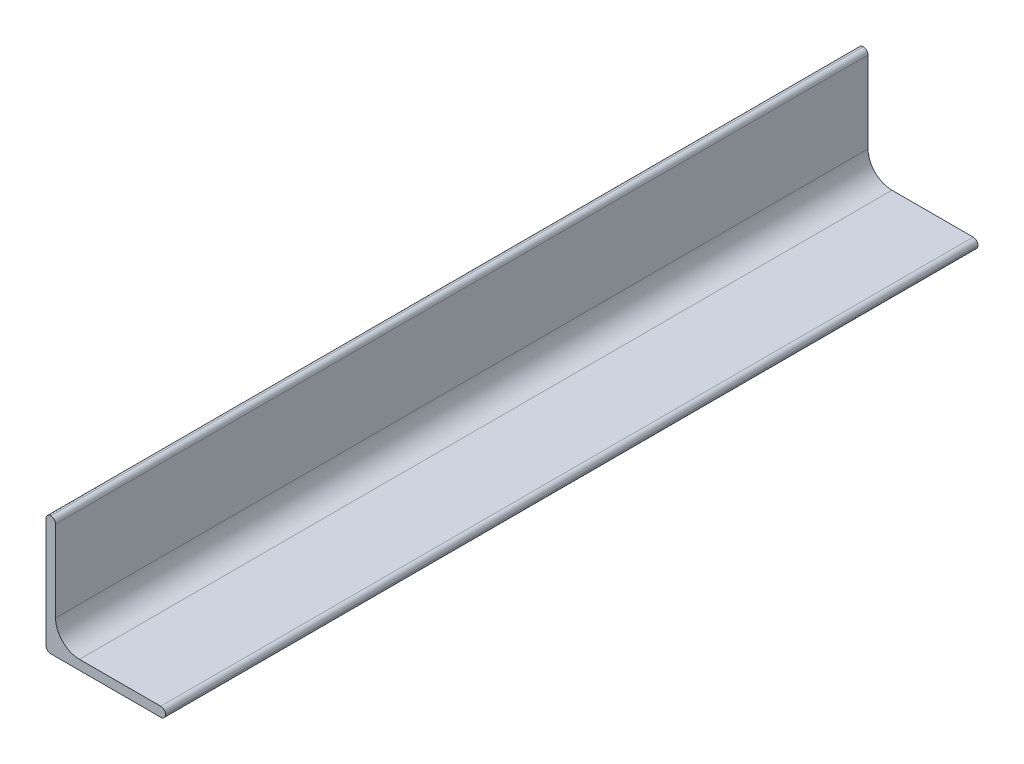
ISO-10303-21;
HEADER;
FILE_DESCRIPTION(('STEP AP214'),'2;1');
FILE_NAME('part.step','',(''),(''),'','','');
FILE_SCHEMA(('AUTOMOTIVE_DESIGN { 1 0 10303 214 1 1 1 1 }'));
ENDSEC;
DATA;
#1=APPLICATION_CONTEXT('core data for automotive mechanical design processes');
#2=APPLICATION_PROTOCOL_DEFINITION('international standard','automotive_design',2000,#1);
#3=PRODUCT_CONTEXT('',#1,'mechanical');
#4=PRODUCT('Part','Part','',(#3));
#5=PRODUCT_RELATED_PRODUCT_CATEGORY('part','',(#4));
#6=PRODUCT_DEFINITION_FORMATION('','',#4);
#7=PRODUCT_DEFINITION_CONTEXT('part definition',#1,'design');
#8=PRODUCT_DEFINITION('design','',#6,#7);
#9=PRODUCT_DEFINITION_SHAPE('','',#8);
#10=(LENGTH_UNIT() NAMED_UNIT(*) SI_UNIT(.MILLI.,.METRE.));
#11=(NAMED_UNIT(*) PLANE_ANGLE_UNIT() SI_UNIT($,.RADIAN.));
#12=(NAMED_UNIT(*) SI_UNIT($,.STERADIAN.) SOLID_ANGLE_UNIT());
#13=UNCERTAINTY_MEASURE_WITH_UNIT(LENGTH_MEASURE(1.E-05),#10,'distance_accuracy_value','');
#14=(GEOMETRIC_REPRESENTATION_CONTEXT(3) GLOBAL_UNCERTAINTY_ASSIGNED_CONTEXT((#13)) GLOBAL_UNIT_ASSIGNED_CONTEXT((#10,
#11,#12)) REPRESENTATION_CONTEXT('',''));
#15=CARTESIAN_POINT('',(0.,0.,0.));
#16=DIRECTION('',(0.,0.,1.));
#17=DIRECTION('',(1.,0.,0.));
#18=AXIS2_PLACEMENT_3D('',#15,#16,#17);
#19=CARTESIAN_POINT('',(0.,25.,170.));
#20=DIRECTION('',(1.,0.,0.));
#21=DIRECTION('',(0.,0.,-1.));
#22=AXIS2_PLACEMENT_3D('',#19,#20,#21);
#23=PLANE('',#22);
#24=DIRECTION('',(0.,-1.,0.));
#25=VECTOR('',#24,1.);
#26=CARTESIAN_POINT('',(0.,25.,170.));
#27=LINE('',#26,#25);
#28=CARTESIAN_POINT('',(0.,24.,170.));
#29=VERTEX_POINT('',#28);
#30=CARTESIAN_POINT('',(0.,1.,170.));
#31=VERTEX_POINT('',#30);
#32=EDGE_CURVE('E160',#29,#31,#27,.T.);
#33=ORIENTED_EDGE('',*,*,#32,.F.);
#34=DIRECTION('',(0.,0.,-1.));
#35=VECTOR('',#34,1.);
#36=CARTESIAN_POINT('',(0.,24.,170.));
#37=LINE('',#36,#35);
#38=CARTESIAN_POINT('',(0.,24.,0.));
#39=VERTEX_POINT('',#38);
#40=EDGE_CURVE('E163',#29,#39,#37,.T.);
#41=ORIENTED_EDGE('',*,*,#40,.T.);
#42=DIRECTION('',(0.,-1.,0.));
#43=VECTOR('',#42,1.);
#44=CARTESIAN_POINT('',(0.,25.,0.));
#45=LINE('',#44,#43);
#46=CARTESIAN_POINT('',(0.,1.,0.));
#47=VERTEX_POINT('',#46);
#48=EDGE_CURVE('E148',#39,#47,#45,.T.);
#49=ORIENTED_EDGE('',*,*,#48,.T.);
#50=DIRECTION('',(0.,0.,-1.));
#51=VECTOR('',#50,1.);
#52=CARTESIAN_POINT('',(0.,1.,170.));
#53=LINE('',#52,#51);
#54=EDGE_CURVE('E138',#47,#31,#53,.F.);
#55=ORIENTED_EDGE('',*,*,#54,.T.);
#56=EDGE_LOOP('',(#33,#41,#49,#55));
#57=FACE_BOUND('',#56,.T.);
#58=ADVANCED_FACE('F41',(#57),#23,.F.);
#59=CARTESIAN_POINT('',(0.,0.,170.));
#60=DIRECTION('',(0.,1.,0.));
#61=DIRECTION('',(0.,0.,1.));
#62=AXIS2_PLACEMENT_3D('',#59,#60,#61);
#63=PLANE('',#62);
#64=DIRECTION('',(1.,0.,0.));
#65=VECTOR('',#64,1.);
#66=CARTESIAN_POINT('',(0.,0.,0.));
#67=LINE('',#66,#65);
#68=CARTESIAN_POINT('',(1.,0.,0.));
#69=VERTEX_POINT('',#68);
#70=CARTESIAN_POINT('',(24.,0.,0.));
#71=VERTEX_POINT('',#70);
#72=EDGE_CURVE('E151',#69,#71,#67,.T.);
#73=ORIENTED_EDGE('',*,*,#72,.T.);
#74=DIRECTION('',(0.,0.,-1.));
#75=VECTOR('',#74,1.);
#76=CARTESIAN_POINT('',(24.,0.,170.));
#77=LINE('',#76,#75);
#78=CARTESIAN_POINT('',(24.,0.,170.));
#79=VERTEX_POINT('',#78);
#80=EDGE_CURVE('E50',#71,#79,#77,.F.);
#81=ORIENTED_EDGE('',*,*,#80,.T.);
#82=DIRECTION('',(1.,0.,0.));
#83=VECTOR('',#82,1.);
#84=CARTESIAN_POINT('',(0.,0.,170.));
#85=LINE('',#84,#83);
#86=CARTESIAN_POINT('',(1.,0.,170.));
#87=VERTEX_POINT('',#86);
#88=EDGE_CURVE('E129',#87,#79,#85,.T.);
#89=ORIENTED_EDGE('',*,*,#88,.F.);
#90=DIRECTION('',(0.,0.,-1.));
#91=VECTOR('',#90,1.);
#92=CARTESIAN_POINT('',(1.,0.,170.));
#93=LINE('',#92,#91);
#94=EDGE_CURVE('E186',#87,#69,#93,.T.);
#95=ORIENTED_EDGE('',*,*,#94,.T.);
#96=EDGE_LOOP('',(#73,#81,#89,#95));
#97=FACE_BOUND('',#96,.T.);
#98=ADVANCED_FACE('F205',(#97),#63,.F.);
#99=CARTESIAN_POINT('',(25.,2.,170.));
#100=DIRECTION('',(0.,-1.,0.));
#101=DIRECTION('',(1.,0.,0.));
#102=AXIS2_PLACEMENT_3D('',#99,#100,#101);
#103=PLANE('',#102);
#104=DIRECTION('',(-1.,0.,0.));
#105=VECTOR('',#104,1.);
#106=CARTESIAN_POINT('',(25.,2.,170.));
#107=LINE('',#106,#105);
#108=CARTESIAN_POINT('',(24.,2.,170.));
#109=VERTEX_POINT('',#108);
#110=CARTESIAN_POINT('',(7.00000000000004,2.,170.));
#111=VERTEX_POINT('',#110);
#112=EDGE_CURVE('E118',#109,#111,#107,.T.);
#113=ORIENTED_EDGE('',*,*,#112,.F.);
#114=DIRECTION('',(0.,0.,-1.));
#115=VECTOR('',#114,1.);
#116=CARTESIAN_POINT('',(24.,2.,170.));
#117=LINE('',#116,#115);
#118=CARTESIAN_POINT('',(24.,2.,0.));
#119=VERTEX_POINT('',#118);
#120=EDGE_CURVE('E184',#109,#119,#117,.T.);
#121=ORIENTED_EDGE('',*,*,#120,.T.);
#122=DIRECTION('',(-1.,0.,0.));
#123=VECTOR('',#122,1.);
#124=CARTESIAN_POINT('',(25.,2.,0.));
#125=LINE('',#124,#123);
#126=CARTESIAN_POINT('',(7.00000000000004,2.,0.));
#127=VERTEX_POINT('',#126);
#128=EDGE_CURVE('E135',#119,#127,#125,.T.);
#129=ORIENTED_EDGE('',*,*,#128,.T.);
#130=DIRECTION('',(0.,0.,-1.));
#131=VECTOR('',#130,1.);
#132=CARTESIAN_POINT('',(7.00000000000004,2.,170.));
#133=LINE('',#132,#131);
#134=EDGE_CURVE('E132',#111,#127,#133,.T.);
#135=ORIENTED_EDGE('',*,*,#134,.F.);
#136=EDGE_LOOP('',(#113,#121,#129,#135));
#137=FACE_BOUND('',#136,.T.);
#138=ADVANCED_FACE('F133',(#137),#103,.F.);
#139=CARTESIAN_POINT('',(7.,7.,170.));
#140=DIRECTION('',(0.,0.,-1.));
#141=DIRECTION('',(-1.,0.,0.));
#142=AXIS2_PLACEMENT_3D('',#139,#140,#141);
#143=CYLINDRICAL_SURFACE('',#142,5.);
#144=CARTESIAN_POINT('',(7.,7.,0.));
#145=DIRECTION('',(0.,0.,-1.));
#146=DIRECTION('',(-1.,0.,0.));
#147=AXIS2_PLACEMENT_3D('',#144,#145,#146);
#148=CIRCLE('',#147,5.);
#149=CARTESIAN_POINT('',(2.,7.,0.));
#150=VERTEX_POINT('',#149);
#151=EDGE_CURVE('E156',#127,#150,#148,.T.);
#152=ORIENTED_EDGE('',*,*,#151,.T.);
#153=DIRECTION('',(0.,0.,-1.));
#154=VECTOR('',#153,1.);
#155=CARTESIAN_POINT('',(2.,7.,170.));
#156=LINE('',#155,#154);
#157=CARTESIAN_POINT('',(2.,7.,170.));
#158=VERTEX_POINT('',#157);
#159=EDGE_CURVE('E139',#158,#150,#156,.T.);
#160=ORIENTED_EDGE('',*,*,#159,.F.);
#161=CARTESIAN_POINT('',(7.,7.,170.));
#162=DIRECTION('',(0.,0.,-1.));
#163=DIRECTION('',(-1.,0.,0.));
#164=AXIS2_PLACEMENT_3D('',#161,#162,#163);
#165=CIRCLE('',#164,5.);
#166=EDGE_CURVE('E122',#111,#158,#165,.T.);
#167=ORIENTED_EDGE('',*,*,#166,.F.);
#168=ORIENTED_EDGE('',*,*,#134,.T.);
#169=EDGE_LOOP('',(#152,#160,#167,#168));
#170=FACE_BOUND('',#169,.T.);
#171=ADVANCED_FACE('F141',(#170),#143,.F.);
#172=CARTESIAN_POINT('',(2.,7.00000000000003,170.));
#173=DIRECTION('',(-1.,0.,0.));
#174=DIRECTION('',(0.,-1.,0.));
#175=AXIS2_PLACEMENT_3D('',#172,#173,#174);
#176=PLANE('',#175);
#177=DIRECTION('',(0.,1.,0.));
#178=VECTOR('',#177,1.);
#179=CARTESIAN_POINT('',(2.,7.00000000000003,0.));
#180=LINE('',#179,#178);
#181=CARTESIAN_POINT('',(2.,24.,0.));
#182=VERTEX_POINT('',#181);
#183=EDGE_CURVE('E158',#150,#182,#180,.T.);
#184=ORIENTED_EDGE('',*,*,#183,.T.);
#185=DIRECTION('',(0.,0.,-1.));
#186=VECTOR('',#185,1.);
#187=CARTESIAN_POINT('',(2.,24.,170.));
#188=LINE('',#187,#186);
#189=CARTESIAN_POINT('',(2.,24.,170.));
#190=VERTEX_POINT('',#189);
#191=EDGE_CURVE('E11',#182,#190,#188,.F.);
#192=ORIENTED_EDGE('',*,*,#191,.T.);
#193=DIRECTION('',(0.,1.,0.));
#194=VECTOR('',#193,1.);
#195=CARTESIAN_POINT('',(2.,7.00000000000003,170.));
#196=LINE('',#195,#194);
#197=EDGE_CURVE('E143',#158,#190,#196,.T.);
#198=ORIENTED_EDGE('',*,*,#197,.F.);
#199=ORIENTED_EDGE('',*,*,#159,.T.);
#200=EDGE_LOOP('',(#184,#192,#198,#199));
#201=FACE_BOUND('',#200,.T.);
#202=ADVANCED_FACE('F242',(#201),#176,.F.);
#203=CARTESIAN_POINT('',(7.,7.,170.));
#204=DIRECTION('',(0.,0.,-1.));
#205=DIRECTION('',(-1.,0.,0.));
#206=AXIS2_PLACEMENT_3D('',#203,#204,#205);
#207=PLANE('',#206);
#208=CARTESIAN_POINT('',(24.,1.,170.));
#209=DIRECTION('',(0.,0.,-1.));
#210=DIRECTION('',(-1.,0.,0.));
#211=AXIS2_PLACEMENT_3D('',#208,#209,#210);
#212=CIRCLE('',#211,1.);
#213=CARTESIAN_POINT('',(25.,1.,170.));
#214=VERTEX_POINT('',#213);
#215=EDGE_CURVE('E181',#79,#214,#212,.F.);
#216=ORIENTED_EDGE('',*,*,#215,.T.);
#217=CARTESIAN_POINT('',(24.,1.,170.));
#218=DIRECTION('',(0.,0.,-1.));
#219=DIRECTION('',(-1.,0.,0.));
#220=AXIS2_PLACEMENT_3D('',#217,#218,#219);
#221=CIRCLE('',#220,1.);
#222=EDGE_CURVE('E125',#214,#109,#221,.F.);
#223=ORIENTED_EDGE('',*,*,#222,.T.);
#224=ORIENTED_EDGE('',*,*,#112,.T.);
#225=ORIENTED_EDGE('',*,*,#166,.T.);
#226=ORIENTED_EDGE('',*,*,#197,.T.);
#227=CARTESIAN_POINT('',(1.,24.,170.));
#228=DIRECTION('',(0.,0.,-1.));
#229=DIRECTION('',(-1.,0.,0.));
#230=AXIS2_PLACEMENT_3D('',#227,#228,#229);
#231=CIRCLE('',#230,1.);
#232=CARTESIAN_POINT('',(1.,25.,170.));
#233=VERTEX_POINT('',#232);
#234=EDGE_CURVE('E58',#190,#233,#231,.F.);
#235=ORIENTED_EDGE('',*,*,#234,.T.);
#236=CARTESIAN_POINT('',(1.,24.,170.));
#237=DIRECTION('',(0.,0.,-1.));
#238=DIRECTION('',(-1.,0.,0.));
#239=AXIS2_PLACEMENT_3D('',#236,#237,#238);
#240=CIRCLE('',#239,1.);
#241=EDGE_CURVE('E177',#233,#29,#240,.F.);
#242=ORIENTED_EDGE('',*,*,#241,.T.);
#243=ORIENTED_EDGE('',*,*,#32,.T.);
#244=CARTESIAN_POINT('',(1.,1.,170.));
#245=DIRECTION('',(0.,0.,-1.));
#246=DIRECTION('',(-1.,0.,0.));
#247=AXIS2_PLACEMENT_3D('',#244,#245,#246);
#248=CIRCLE('',#247,1.);
#249=EDGE_CURVE('E179',#31,#87,#248,.F.);
#250=ORIENTED_EDGE('',*,*,#249,.T.);
#251=ORIENTED_EDGE('',*,*,#88,.T.);
#252=EDGE_LOOP('',(#216,#223,#224,#225,#226,#235,#242,#243,#250,#251));
#253=FACE_BOUND('',#252,.T.);
#254=ADVANCED_FACE('F120',(#253),#207,.F.);
#255=CARTESIAN_POINT('',(7.,7.,0.));
#256=DIRECTION('',(0.,0.,-1.));
#257=DIRECTION('',(-1.,0.,0.));
#258=AXIS2_PLACEMENT_3D('',#255,#256,#257);
#259=PLANE('',#258);
#260=ORIENTED_EDGE('',*,*,#128,.F.);
#261=CARTESIAN_POINT('',(24.,1.,0.));
#262=DIRECTION('',(0.,0.,-1.));
#263=DIRECTION('',(-1.,0.,0.));
#264=AXIS2_PLACEMENT_3D('',#261,#262,#263);
#265=CIRCLE('',#264,1.);
#266=CARTESIAN_POINT('',(25.,1.,0.));
#267=VERTEX_POINT('',#266);
#268=EDGE_CURVE('E174',#119,#267,#265,.T.);
#269=ORIENTED_EDGE('',*,*,#268,.T.);
#270=CARTESIAN_POINT('',(24.,1.,0.));
#271=DIRECTION('',(0.,0.,-1.));
#272=DIRECTION('',(-1.,0.,0.));
#273=AXIS2_PLACEMENT_3D('',#270,#271,#272);
#274=CIRCLE('',#273,1.);
#275=EDGE_CURVE('E172',#267,#71,#274,.T.);
#276=ORIENTED_EDGE('',*,*,#275,.T.);
#277=ORIENTED_EDGE('',*,*,#72,.F.);
#278=CARTESIAN_POINT('',(1.,1.,0.));
#279=DIRECTION('',(0.,0.,-1.));
#280=DIRECTION('',(-1.,0.,0.));
#281=AXIS2_PLACEMENT_3D('',#278,#279,#280);
#282=CIRCLE('',#281,1.);
#283=EDGE_CURVE('E170',#69,#47,#282,.T.);
#284=ORIENTED_EDGE('',*,*,#283,.T.);
#285=ORIENTED_EDGE('',*,*,#48,.F.);
#286=CARTESIAN_POINT('',(1.,24.,0.));
#287=DIRECTION('',(0.,0.,-1.));
#288=DIRECTION('',(-1.,0.,0.));
#289=AXIS2_PLACEMENT_3D('',#286,#287,#288);
#290=CIRCLE('',#289,1.);
#291=CARTESIAN_POINT('',(1.,25.,0.));
#292=VERTEX_POINT('',#291);
#293=EDGE_CURVE('E168',#39,#292,#290,.T.);
#294=ORIENTED_EDGE('',*,*,#293,.T.);
#295=CARTESIAN_POINT('',(1.,24.,0.));
#296=DIRECTION('',(0.,0.,-1.));
#297=DIRECTION('',(-1.,0.,0.));
#298=AXIS2_PLACEMENT_3D('',#295,#296,#297);
#299=CIRCLE('',#298,1.);
#300=EDGE_CURVE('E166',#292,#182,#299,.T.);
#301=ORIENTED_EDGE('',*,*,#300,.T.);
#302=ORIENTED_EDGE('',*,*,#183,.F.);
#303=ORIENTED_EDGE('',*,*,#151,.F.);
#304=EDGE_LOOP('',(#260,#269,#276,#277,#284,#285,#294,#301,#302,#303));
#305=FACE_BOUND('',#304,.T.);
#306=ADVANCED_FACE('F203',(#305),#259,.T.);
#307=CARTESIAN_POINT('',(1.,24.,170.));
#308=DIRECTION('',(0.,0.,-1.));
#309=DIRECTION('',(-1.,0.,0.));
#310=AXIS2_PLACEMENT_3D('',#307,#308,#309);
#311=CYLINDRICAL_SURFACE('',#310,1.);
#312=DIRECTION('',(0.,0.,-1.));
#313=VECTOR('',#312,1.);
#314=CARTESIAN_POINT('',(1.,25.,170.));
#315=LINE('',#314,#313);
#316=EDGE_CURVE('E152',#233,#292,#315,.T.);
#317=ORIENTED_EDGE('',*,*,#316,.F.);
#318=ORIENTED_EDGE('',*,*,#234,.F.);
#319=ORIENTED_EDGE('',*,*,#191,.F.);
#320=ORIENTED_EDGE('',*,*,#300,.F.);
#321=EDGE_LOOP('',(#317,#318,#319,#320));
#322=FACE_BOUND('',#321,.T.);
#323=ADVANCED_FACE('F221',(#322),#311,.T.);
#324=CARTESIAN_POINT('',(1.,24.,170.));
#325=DIRECTION('',(0.,0.,-1.));
#326=DIRECTION('',(-1.,0.,0.));
#327=AXIS2_PLACEMENT_3D('',#324,#325,#326);
#328=CYLINDRICAL_SURFACE('',#327,1.);
#329=ORIENTED_EDGE('',*,*,#241,.F.);
#330=ORIENTED_EDGE('',*,*,#316,.T.);
#331=ORIENTED_EDGE('',*,*,#293,.F.);
#332=ORIENTED_EDGE('',*,*,#40,.F.);
#333=EDGE_LOOP('',(#329,#330,#331,#332));
#334=FACE_BOUND('',#333,.T.);
#335=ADVANCED_FACE('F217',(#334),#328,.T.);
#336=CARTESIAN_POINT('',(24.,1.,170.));
#337=DIRECTION('',(0.,0.,-1.));
#338=DIRECTION('',(-1.,0.,0.));
#339=AXIS2_PLACEMENT_3D('',#336,#337,#338);
#340=CYLINDRICAL_SURFACE('',#339,1.);
#341=DIRECTION('',(0.,0.,-1.));
#342=VECTOR('',#341,1.);
#343=CARTESIAN_POINT('',(25.,1.,170.));
#344=LINE('',#343,#342);
#345=EDGE_CURVE('E45',#214,#267,#344,.T.);
#346=ORIENTED_EDGE('',*,*,#345,.F.);
#347=ORIENTED_EDGE('',*,*,#215,.F.);
#348=ORIENTED_EDGE('',*,*,#80,.F.);
#349=ORIENTED_EDGE('',*,*,#275,.F.);
#350=EDGE_LOOP('',(#346,#347,#348,#349));
#351=FACE_BOUND('',#350,.T.);
#352=ADVANCED_FACE('F199',(#351),#340,.T.);
#353=CARTESIAN_POINT('',(24.,1.,170.));
#354=DIRECTION('',(0.,0.,-1.));
#355=DIRECTION('',(-1.,0.,0.));
#356=AXIS2_PLACEMENT_3D('',#353,#354,#355);
#357=CYLINDRICAL_SURFACE('',#356,1.);
#358=ORIENTED_EDGE('',*,*,#222,.F.);
#359=ORIENTED_EDGE('',*,*,#345,.T.);
#360=ORIENTED_EDGE('',*,*,#268,.F.);
#361=ORIENTED_EDGE('',*,*,#120,.F.);
#362=EDGE_LOOP('',(#358,#359,#360,#361));
#363=FACE_BOUND('',#362,.T.);
#364=ADVANCED_FACE('F195',(#363),#357,.T.);
#365=CARTESIAN_POINT('',(1.,1.,170.));
#366=DIRECTION('',(0.,0.,-1.));
#367=DIRECTION('',(-1.,0.,0.));
#368=AXIS2_PLACEMENT_3D('',#365,#366,#367);
#369=CYLINDRICAL_SURFACE('',#368,1.);
#370=ORIENTED_EDGE('',*,*,#249,.F.);
#371=ORIENTED_EDGE('',*,*,#54,.F.);
#372=ORIENTED_EDGE('',*,*,#283,.F.);
#373=ORIENTED_EDGE('',*,*,#94,.F.);
#374=EDGE_LOOP('',(#370,#371,#372,#373));
#375=FACE_BOUND('',#374,.T.);
#376=ADVANCED_FACE('F43',(#375),#369,.T.);
#377=CLOSED_SHELL('',(#58,#98,#138,#171,#202,#254,#306,#323,#335,#352,#364,#376));
#378=MANIFOLD_SOLID_BREP('B2',#377);
#379=ADVANCED_BREP_SHAPE_REPRESENTATION('',(#18,#378),#14);
#380=SHAPE_DEFINITION_REPRESENTATION(#9,#379);
ENDSEC;
END-ISO-10303-21;
